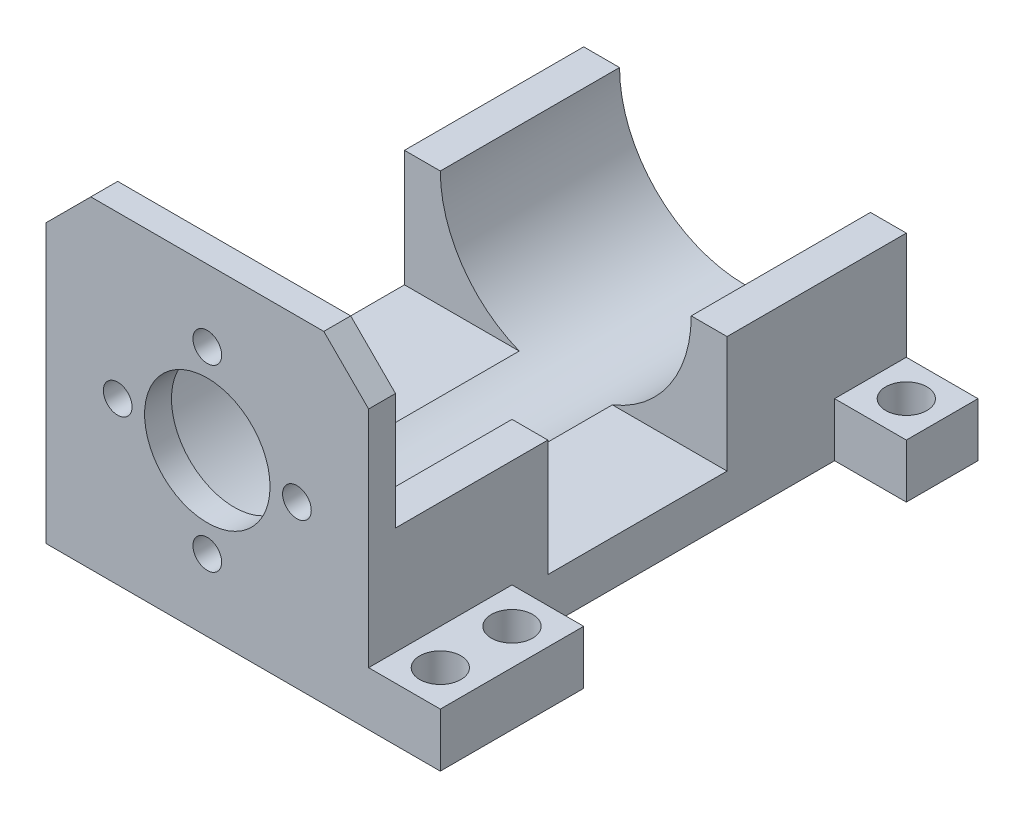
ISO-10303-21;
HEADER;
FILE_DESCRIPTION(('STEP AP214'),'2;1');
FILE_NAME('part.step','',(''),(''),'','','');
FILE_SCHEMA(('AUTOMOTIVE_DESIGN { 1 0 10303 214 1 1 1 1 }'));
ENDSEC;
DATA;
#1=APPLICATION_CONTEXT('core data for automotive mechanical design processes');
#2=APPLICATION_PROTOCOL_DEFINITION('international standard','automotive_design',2000,#1);
#3=PRODUCT_CONTEXT('',#1,'mechanical');
#4=PRODUCT('Part','Part','',(#3));
#5=PRODUCT_RELATED_PRODUCT_CATEGORY('part','',(#4));
#6=PRODUCT_DEFINITION_FORMATION('','',#4);
#7=PRODUCT_DEFINITION_CONTEXT('part definition',#1,'design');
#8=PRODUCT_DEFINITION('design','',#6,#7);
#9=PRODUCT_DEFINITION_SHAPE('','',#8);
#10=(LENGTH_UNIT() NAMED_UNIT(*) SI_UNIT(.MILLI.,.METRE.));
#11=(NAMED_UNIT(*) PLANE_ANGLE_UNIT() SI_UNIT($,.RADIAN.));
#12=(NAMED_UNIT(*) SI_UNIT($,.STERADIAN.) SOLID_ANGLE_UNIT());
#13=UNCERTAINTY_MEASURE_WITH_UNIT(LENGTH_MEASURE(1.E-05),#10,'distance_accuracy_value','');
#14=(GEOMETRIC_REPRESENTATION_CONTEXT(3) GLOBAL_UNCERTAINTY_ASSIGNED_CONTEXT((#13)) GLOBAL_UNIT_ASSIGNED_CONTEXT((#10,
#11,#12)) REPRESENTATION_CONTEXT('',''));
#15=CARTESIAN_POINT('',(0.,0.,0.));
#16=DIRECTION('',(0.,0.,1.));
#17=DIRECTION('',(1.,0.,0.));
#18=AXIS2_PLACEMENT_3D('',#15,#16,#17);
#19=CARTESIAN_POINT('',(18.,0.,-60.));
#20=DIRECTION('',(1.,0.,0.));
#21=DIRECTION('',(0.,0.,-1.));
#22=AXIS2_PLACEMENT_3D('',#19,#20,#21);
#23=PLANE('',#22);
#24=DIRECTION('',(0.,0.,1.));
#25=VECTOR('',#24,1.);
#26=CARTESIAN_POINT('',(18.,-12.,-16.));
#27=LINE('',#26,#25);
#28=CARTESIAN_POINT('',(18.,-12.,-16.));
#29=VERTEX_POINT('',#28);
#30=CARTESIAN_POINT('',(18.,-12.,0.));
#31=VERTEX_POINT('',#30);
#32=EDGE_CURVE('E282',#29,#31,#27,.T.);
#33=ORIENTED_EDGE('',*,*,#32,.F.);
#34=DIRECTION('',(0.,-1.,0.));
#35=VECTOR('',#34,1.);
#36=CARTESIAN_POINT('',(18.,-12.,-16.));
#37=LINE('',#36,#35);
#38=CARTESIAN_POINT('',(18.,-18.,-16.));
#39=VERTEX_POINT('',#38);
#40=EDGE_CURVE('E986',#29,#39,#37,.T.);
#41=ORIENTED_EDGE('',*,*,#40,.T.);
#42=DIRECTION('',(0.,0.,1.));
#43=VECTOR('',#42,1.);
#44=CARTESIAN_POINT('',(18.,-18.,-60.));
#45=LINE('',#44,#43);
#46=CARTESIAN_POINT('',(18.,-18.,-52.));
#47=VERTEX_POINT('',#46);
#48=EDGE_CURVE('E12',#47,#39,#45,.T.);
#49=ORIENTED_EDGE('',*,*,#48,.F.);
#50=DIRECTION('',(0.,-1.,0.));
#51=VECTOR('',#50,1.);
#52=CARTESIAN_POINT('',(18.,-12.,-52.));
#53=LINE('',#52,#51);
#54=CARTESIAN_POINT('',(18.,-12.,-52.));
#55=VERTEX_POINT('',#54);
#56=EDGE_CURVE('E345',#55,#47,#53,.T.);
#57=ORIENTED_EDGE('',*,*,#56,.F.);
#58=DIRECTION('',(0.,0.,1.));
#59=VECTOR('',#58,1.);
#60=CARTESIAN_POINT('',(18.,-12.,0.));
#61=LINE('',#60,#59);
#62=CARTESIAN_POINT('',(18.,-12.,-60.));
#63=VERTEX_POINT('',#62);
#64=EDGE_CURVE('E328',#63,#55,#61,.T.);
#65=ORIENTED_EDGE('',*,*,#64,.F.);
#66=DIRECTION('',(0.,1.,0.));
#67=VECTOR('',#66,1.);
#68=CARTESIAN_POINT('',(18.,0.,-60.));
#69=LINE('',#68,#67);
#70=CARTESIAN_POINT('',(18.,0.,-60.));
#71=VERTEX_POINT('',#70);
#72=EDGE_CURVE('E464',#63,#71,#69,.T.);
#73=ORIENTED_EDGE('',*,*,#72,.T.);
#74=DIRECTION('',(0.,0.,1.));
#75=VECTOR('',#74,1.);
#76=CARTESIAN_POINT('',(18.,0.,-60.));
#77=LINE('',#76,#75);
#78=CARTESIAN_POINT('',(18.,0.,-40.));
#79=VERTEX_POINT('',#78);
#80=EDGE_CURVE('E72',#71,#79,#77,.T.);
#81=ORIENTED_EDGE('',*,*,#80,.T.);
#82=DIRECTION('',(0.,1.,0.));
#83=VECTOR('',#82,1.);
#84=CARTESIAN_POINT('',(18.,0.,-40.));
#85=LINE('',#84,#83);
#86=CARTESIAN_POINT('',(18.,-13.,-40.));
#87=VERTEX_POINT('',#86);
#88=EDGE_CURVE('E369',#87,#79,#85,.T.);
#89=ORIENTED_EDGE('',*,*,#88,.F.);
#90=DIRECTION('',(0.,0.,-1.));
#91=VECTOR('',#90,1.);
#92=CARTESIAN_POINT('',(18.,-13.,-60.));
#93=LINE('',#92,#91);
#94=CARTESIAN_POINT('',(18.,-13.,-20.));
#95=VERTEX_POINT('',#94);
#96=EDGE_CURVE('E375',#95,#87,#93,.T.);
#97=ORIENTED_EDGE('',*,*,#96,.F.);
#98=DIRECTION('',(0.,-1.,0.));
#99=VECTOR('',#98,1.);
#100=CARTESIAN_POINT('',(18.,0.,-20.));
#101=LINE('',#100,#99);
#102=CARTESIAN_POINT('',(18.,0.,-20.));
#103=VERTEX_POINT('',#102);
#104=EDGE_CURVE('E384',#103,#95,#101,.T.);
#105=ORIENTED_EDGE('',*,*,#104,.F.);
#106=CARTESIAN_POINT('',(18.,0.,-3.));
#107=VERTEX_POINT('',#106);
#108=EDGE_CURVE('E479',#103,#107,#77,.T.);
#109=ORIENTED_EDGE('',*,*,#108,.T.);
#110=DIRECTION('',(0.,-1.,0.));
#111=VECTOR('',#110,1.);
#112=CARTESIAN_POINT('',(18.,0.,-3.));
#113=LINE('',#112,#111);
#114=CARTESIAN_POINT('',(18.,13.,-3.));
#115=VERTEX_POINT('',#114);
#116=EDGE_CURVE('E412',#115,#107,#113,.T.);
#117=ORIENTED_EDGE('',*,*,#116,.F.);
#118=DIRECTION('',(0.,0.,1.));
#119=VECTOR('',#118,1.);
#120=CARTESIAN_POINT('',(18.,13.,-3.));
#121=LINE('',#120,#119);
#122=CARTESIAN_POINT('',(18.,13.,0.));
#123=VERTEX_POINT('',#122);
#124=EDGE_CURVE('E430',#115,#123,#121,.T.);
#125=ORIENTED_EDGE('',*,*,#124,.T.);
#126=DIRECTION('',(0.,1.,0.));
#127=VECTOR('',#126,1.);
#128=CARTESIAN_POINT('',(18.,0.,0.));
#129=LINE('',#128,#127);
#130=EDGE_CURVE('E457',#31,#123,#129,.T.);
#131=ORIENTED_EDGE('',*,*,#130,.F.);
#132=EDGE_LOOP('',(#33,#41,#49,#57,#65,#73,#81,#89,#97,#105,#109,#117,#125,#131));
#133=FACE_BOUND('',#132,.T.);
#134=ADVANCED_FACE('F69',(#133),#23,.T.);
#135=CARTESIAN_POINT('',(0.,0.,-60.));
#136=DIRECTION('',(0.,-1.,0.));
#137=DIRECTION('',(0.,0.,-1.));
#138=AXIS2_PLACEMENT_3D('',#135,#136,#137);
#139=PLANE('',#138);
#140=DIRECTION('',(0.,0.,1.));
#141=VECTOR('',#140,1.);
#142=CARTESIAN_POINT('',(-14.,0.,-60.));
#143=LINE('',#142,#141);
#144=CARTESIAN_POINT('',(-14.,0.,-20.));
#145=VERTEX_POINT('',#144);
#146=CARTESIAN_POINT('',(-14.,0.,-3.));
#147=VERTEX_POINT('',#146);
#148=EDGE_CURVE('E492',#145,#147,#143,.T.);
#149=ORIENTED_EDGE('',*,*,#148,.F.);
#150=DIRECTION('',(-1.,0.,0.));
#151=VECTOR('',#150,1.);
#152=CARTESIAN_POINT('',(32.,0.,-20.));
#153=LINE('',#152,#151);
#154=CARTESIAN_POINT('',(-18.,0.,-20.));
#155=VERTEX_POINT('',#154);
#156=EDGE_CURVE('E357',#145,#155,#153,.T.);
#157=ORIENTED_EDGE('',*,*,#156,.T.);
#158=DIRECTION('',(0.,0.,1.));
#159=VECTOR('',#158,1.);
#160=CARTESIAN_POINT('',(-18.,0.,-60.));
#161=LINE('',#160,#159);
#162=CARTESIAN_POINT('',(-18.,0.,-3.));
#163=VERTEX_POINT('',#162);
#164=EDGE_CURVE('E489',#155,#163,#161,.T.);
#165=ORIENTED_EDGE('',*,*,#164,.T.);
#166=DIRECTION('',(1.,0.,0.));
#167=VECTOR('',#166,1.);
#168=CARTESIAN_POINT('',(0.,0.,-3.));
#169=LINE('',#168,#167);
#170=EDGE_CURVE('E427',#163,#147,#169,.T.);
#171=ORIENTED_EDGE('',*,*,#170,.T.);
#172=EDGE_LOOP('',(#149,#157,#165,#171));
#173=FACE_BOUND('',#172,.T.);
#174=ADVANCED_FACE('F520',(#173),#139,.F.);
#175=CARTESIAN_POINT('',(0.,0.,-60.));
#176=DIRECTION('',(0.,1.,0.));
#177=DIRECTION('',(0.,0.,1.));
#178=AXIS2_PLACEMENT_3D('',#175,#176,#177);
#179=PLANE('',#178);
#180=CARTESIAN_POINT('',(14.,0.,-20.));
#181=VERTEX_POINT('',#180);
#182=EDGE_CURVE('E360',#103,#181,#153,.T.);
#183=ORIENTED_EDGE('',*,*,#182,.T.);
#184=DIRECTION('',(0.,0.,1.));
#185=VECTOR('',#184,1.);
#186=CARTESIAN_POINT('',(14.,0.,-60.));
#187=LINE('',#186,#185);
#188=CARTESIAN_POINT('',(14.,0.,-3.));
#189=VERTEX_POINT('',#188);
#190=EDGE_CURVE('E495',#181,#189,#187,.T.);
#191=ORIENTED_EDGE('',*,*,#190,.T.);
#192=DIRECTION('',(-1.,0.,0.));
#193=VECTOR('',#192,1.);
#194=CARTESIAN_POINT('',(0.,0.,-3.));
#195=LINE('',#194,#193);
#196=EDGE_CURVE('E409',#107,#189,#195,.T.);
#197=ORIENTED_EDGE('',*,*,#196,.F.);
#198=ORIENTED_EDGE('',*,*,#108,.F.);
#199=EDGE_LOOP('',(#183,#191,#197,#198));
#200=FACE_BOUND('',#199,.T.);
#201=ADVANCED_FACE('F517',(#200),#179,.T.);
#202=CARTESIAN_POINT('',(-18.,0.,-60.));
#203=VERTEX_POINT('',#202);
#204=CARTESIAN_POINT('',(-18.,0.,-40.));
#205=VERTEX_POINT('',#204);
#206=EDGE_CURVE('E486',#203,#205,#161,.T.);
#207=ORIENTED_EDGE('',*,*,#206,.T.);
#208=DIRECTION('',(-1.,0.,0.));
#209=VECTOR('',#208,1.);
#210=CARTESIAN_POINT('',(32.,0.,-40.));
#211=LINE('',#210,#209);
#212=CARTESIAN_POINT('',(-14.,0.,-40.));
#213=VERTEX_POINT('',#212);
#214=EDGE_CURVE('E356',#213,#205,#211,.T.);
#215=ORIENTED_EDGE('',*,*,#214,.F.);
#216=CARTESIAN_POINT('',(-14.,0.,-60.));
#217=VERTEX_POINT('',#216);
#218=EDGE_CURVE('E490',#217,#213,#143,.T.);
#219=ORIENTED_EDGE('',*,*,#218,.F.);
#220=DIRECTION('',(1.,0.,0.));
#221=VECTOR('',#220,1.);
#222=CARTESIAN_POINT('',(0.,0.,-60.));
#223=LINE('',#222,#221);
#224=EDGE_CURVE('E472',#203,#217,#223,.T.);
#225=ORIENTED_EDGE('',*,*,#224,.F.);
#226=EDGE_LOOP('',(#207,#215,#219,#225));
#227=FACE_BOUND('',#226,.T.);
#228=ADVANCED_FACE('F519',(#227),#139,.F.);
#229=CARTESIAN_POINT('',(0.,0.,-60.));
#230=DIRECTION('',(0.,0.,1.));
#231=DIRECTION('',(1.,0.,0.));
#232=AXIS2_PLACEMENT_3D('',#229,#230,#231);
#233=CYLINDRICAL_SURFACE('',#232,14.);
#234=DIRECTION('',(0.,0.,1.));
#235=VECTOR('',#234,1.);
#236=CARTESIAN_POINT('',(-5.19615242270665,-13.,-60.));
#237=LINE('',#236,#235);
#238=CARTESIAN_POINT('',(-5.19615242270665,-13.,-40.));
#239=VERTEX_POINT('',#238);
#240=CARTESIAN_POINT('',(-5.19615242270664,-13.,-20.));
#241=VERTEX_POINT('',#240);
#242=EDGE_CURVE('E378',#239,#241,#237,.T.);
#243=ORIENTED_EDGE('',*,*,#242,.T.);
#244=CARTESIAN_POINT('',(0.,0.,-20.));
#245=DIRECTION('',(0.,0.,1.));
#246=DIRECTION('',(1.,0.,0.));
#247=AXIS2_PLACEMENT_3D('',#244,#245,#246);
#248=CIRCLE('',#247,14.);
#249=EDGE_CURVE('E386',#241,#145,#248,.F.);
#250=ORIENTED_EDGE('',*,*,#249,.T.);
#251=ORIENTED_EDGE('',*,*,#148,.T.);
#252=CARTESIAN_POINT('',(0.,0.,-3.));
#253=DIRECTION('',(0.,0.,1.));
#254=DIRECTION('',(1.,0.,0.));
#255=AXIS2_PLACEMENT_3D('',#252,#253,#254);
#256=CIRCLE('',#255,14.);
#257=EDGE_CURVE('E406',#147,#189,#256,.T.);
#258=ORIENTED_EDGE('',*,*,#257,.T.);
#259=ORIENTED_EDGE('',*,*,#190,.F.);
#260=CARTESIAN_POINT('',(5.19615242270665,-13.,-20.));
#261=VERTEX_POINT('',#260);
#262=EDGE_CURVE('E389',#181,#261,#248,.F.);
#263=ORIENTED_EDGE('',*,*,#262,.T.);
#264=DIRECTION('',(0.,0.,1.));
#265=VECTOR('',#264,1.);
#266=CARTESIAN_POINT('',(5.19615242270665,-13.,-60.));
#267=LINE('',#266,#265);
#268=CARTESIAN_POINT('',(5.19615242270665,-13.,-40.));
#269=VERTEX_POINT('',#268);
#270=EDGE_CURVE('E381',#261,#269,#267,.F.);
#271=ORIENTED_EDGE('',*,*,#270,.T.);
#272=CARTESIAN_POINT('',(0.,0.,-40.));
#273=DIRECTION('',(0.,0.,-1.));
#274=DIRECTION('',(-1.,0.,0.));
#275=AXIS2_PLACEMENT_3D('',#272,#273,#274);
#276=CIRCLE('',#275,14.);
#277=CARTESIAN_POINT('',(14.,0.,-40.));
#278=VERTEX_POINT('',#277);
#279=EDGE_CURVE('E371',#269,#278,#276,.F.);
#280=ORIENTED_EDGE('',*,*,#279,.T.);
#281=CARTESIAN_POINT('',(14.,0.,-60.));
#282=VERTEX_POINT('',#281);
#283=EDGE_CURVE('E493',#282,#278,#187,.T.);
#284=ORIENTED_EDGE('',*,*,#283,.F.);
#285=CARTESIAN_POINT('',(0.,0.,-60.));
#286=DIRECTION('',(0.,0.,1.));
#287=DIRECTION('',(1.,0.,0.));
#288=AXIS2_PLACEMENT_3D('',#285,#286,#287);
#289=CIRCLE('',#288,14.);
#290=EDGE_CURVE('E470',#217,#282,#289,.T.);
#291=ORIENTED_EDGE('',*,*,#290,.F.);
#292=ORIENTED_EDGE('',*,*,#218,.T.);
#293=EDGE_CURVE('E374',#213,#239,#276,.F.);
#294=ORIENTED_EDGE('',*,*,#293,.T.);
#295=EDGE_LOOP('',(#243,#250,#251,#258,#259,#263,#271,#280,#284,#291,#292,#294));
#296=FACE_BOUND('',#295,.T.);
#297=ADVANCED_FACE('F526',(#296),#233,.F.);
#298=EDGE_CURVE('E367',#79,#278,#211,.T.);
#299=ORIENTED_EDGE('',*,*,#298,.F.);
#300=ORIENTED_EDGE('',*,*,#80,.F.);
#301=DIRECTION('',(-1.,0.,0.));
#302=VECTOR('',#301,1.);
#303=CARTESIAN_POINT('',(0.,0.,-60.));
#304=LINE('',#303,#302);
#305=EDGE_CURVE('E466',#71,#282,#304,.T.);
#306=ORIENTED_EDGE('',*,*,#305,.T.);
#307=ORIENTED_EDGE('',*,*,#283,.T.);
#308=EDGE_LOOP('',(#299,#300,#306,#307));
#309=FACE_BOUND('',#308,.T.);
#310=ADVANCED_FACE('F521',(#309),#179,.T.);
#311=CARTESIAN_POINT('',(0.,-18.,-60.));
#312=DIRECTION('',(0.,-1.,0.));
#313=DIRECTION('',(0.,0.,-1.));
#314=AXIS2_PLACEMENT_3D('',#311,#312,#313);
#315=PLANE('',#314);
#316=DIRECTION('',(1.,0.,0.));
#317=VECTOR('',#316,1.);
#318=CARTESIAN_POINT('',(0.,-18.,0.));
#319=LINE('',#318,#317);
#320=CARTESIAN_POINT('',(-18.,-18.,0.));
#321=VERTEX_POINT('',#320);
#322=CARTESIAN_POINT('',(26.,-18.,0.));
#323=VERTEX_POINT('',#322);
#324=EDGE_CURVE('E467',#321,#323,#319,.T.);
#325=ORIENTED_EDGE('',*,*,#324,.F.);
#326=DIRECTION('',(0.,0.,1.));
#327=VECTOR('',#326,1.);
#328=CARTESIAN_POINT('',(-18.,-18.,-60.));
#329=LINE('',#328,#327);
#330=CARTESIAN_POINT('',(-18.,-18.,-52.));
#331=VERTEX_POINT('',#330);
#332=EDGE_CURVE('E77',#331,#321,#329,.T.);
#333=ORIENTED_EDGE('',*,*,#332,.F.);
#334=DIRECTION('',(1.,0.,0.));
#335=VECTOR('',#334,1.);
#336=CARTESIAN_POINT('',(0.,-18.,-52.));
#337=LINE('',#336,#335);
#338=CARTESIAN_POINT('',(-30.,-18.,-52.));
#339=VERTEX_POINT('',#338);
#340=EDGE_CURVE('E93',#339,#331,#337,.T.);
#341=ORIENTED_EDGE('',*,*,#340,.F.);
#342=DIRECTION('',(0.,0.,1.));
#343=VECTOR('',#342,1.);
#344=CARTESIAN_POINT('',(-30.,-18.,0.));
#345=LINE('',#344,#343);
#346=CARTESIAN_POINT('',(-30.,-18.,-60.));
#347=VERTEX_POINT('',#346);
#348=EDGE_CURVE('E301',#347,#339,#345,.T.);
#349=ORIENTED_EDGE('',*,*,#348,.F.);
#350=DIRECTION('',(1.,0.,0.));
#351=VECTOR('',#350,1.);
#352=CARTESIAN_POINT('',(0.,-18.,-60.));
#353=LINE('',#352,#351);
#354=CARTESIAN_POINT('',(26.,-18.,-60.));
#355=VERTEX_POINT('',#354);
#356=EDGE_CURVE('E477',#347,#355,#353,.T.);
#357=ORIENTED_EDGE('',*,*,#356,.T.);
#358=DIRECTION('',(0.,0.,1.));
#359=VECTOR('',#358,1.);
#360=CARTESIAN_POINT('',(26.,-18.,0.));
#361=LINE('',#360,#359);
#362=CARTESIAN_POINT('',(26.,-18.,-52.));
#363=VERTEX_POINT('',#362);
#364=EDGE_CURVE('E337',#355,#363,#361,.T.);
#365=ORIENTED_EDGE('',*,*,#364,.T.);
#366=DIRECTION('',(-1.,0.,0.));
#367=VECTOR('',#366,1.);
#368=CARTESIAN_POINT('',(0.,-18.,-52.));
#369=LINE('',#368,#367);
#370=EDGE_CURVE('E322',#363,#47,#369,.T.);
#371=ORIENTED_EDGE('',*,*,#370,.T.);
#372=ORIENTED_EDGE('',*,*,#48,.T.);
#373=DIRECTION('',(-1.,0.,0.));
#374=VECTOR('',#373,1.);
#375=CARTESIAN_POINT('',(26.,-18.,-16.));
#376=LINE('',#375,#374);
#377=CARTESIAN_POINT('',(26.,-18.,-16.));
#378=VERTEX_POINT('',#377);
#379=EDGE_CURVE('E262',#378,#39,#376,.T.);
#380=ORIENTED_EDGE('',*,*,#379,.F.);
#381=DIRECTION('',(0.,0.,-1.));
#382=VECTOR('',#381,1.);
#383=CARTESIAN_POINT('',(26.,-18.,0.));
#384=LINE('',#383,#382);
#385=EDGE_CURVE('E252',#323,#378,#384,.T.);
#386=ORIENTED_EDGE('',*,*,#385,.F.);
#387=EDGE_LOOP('',(#325,#333,#341,#349,#357,#365,#371,#372,#380,#386));
#388=FACE_BOUND('',#387,.T.);
#389=CARTESIAN_POINT('',(22.,-18.,-56.));
#390=DIRECTION('',(0.,-1.,0.));
#391=DIRECTION('',(0.,0.,-1.));
#392=AXIS2_PLACEMENT_3D('',#389,#390,#391);
#393=CIRCLE('',#392,2.3);
#394=CARTESIAN_POINT('',(22.,-18.,-58.3));
#395=VERTEX_POINT('',#394);
#396=EDGE_CURVE('E308',#395,#395,#393,.T.);
#397=ORIENTED_EDGE('',*,*,#396,.F.);
#398=EDGE_LOOP('',(#397));
#399=FACE_BOUND('',#398,.T.);
#400=CARTESIAN_POINT('',(-26.,-18.,-56.));
#401=DIRECTION('',(0.,-1.,0.));
#402=DIRECTION('',(0.,0.,-1.));
#403=AXIS2_PLACEMENT_3D('',#400,#401,#402);
#404=CIRCLE('',#403,2.3);
#405=CARTESIAN_POINT('',(-26.,-18.,-58.3));
#406=VERTEX_POINT('',#405);
#407=EDGE_CURVE('E305',#406,#406,#404,.T.);
#408=ORIENTED_EDGE('',*,*,#407,.F.);
#409=EDGE_LOOP('',(#408));
#410=FACE_BOUND('',#409,.T.);
#411=CARTESIAN_POINT('',(22.,-18.,-4.));
#412=DIRECTION('',(0.,-1.,0.));
#413=DIRECTION('',(0.,0.,-1.));
#414=AXIS2_PLACEMENT_3D('',#411,#412,#413);
#415=CIRCLE('',#414,2.3);
#416=CARTESIAN_POINT('',(22.,-18.,-6.3));
#417=VERTEX_POINT('',#416);
#418=EDGE_CURVE('E288',#417,#417,#415,.T.);
#419=ORIENTED_EDGE('',*,*,#418,.F.);
#420=EDGE_LOOP('',(#419));
#421=FACE_BOUND('',#420,.T.);
#422=CARTESIAN_POINT('',(22.,-18.,-12.));
#423=DIRECTION('',(0.,-1.,0.));
#424=DIRECTION('',(0.,0.,-1.));
#425=AXIS2_PLACEMENT_3D('',#422,#423,#424);
#426=CIRCLE('',#425,2.3);
#427=CARTESIAN_POINT('',(22.,-18.,-14.3));
#428=VERTEX_POINT('',#427);
#429=EDGE_CURVE('E277',#428,#428,#426,.T.);
#430=ORIENTED_EDGE('',*,*,#429,.F.);
#431=EDGE_LOOP('',(#430));
#432=FACE_BOUND('',#431,.T.);
#433=ADVANCED_FACE('F271',(#388,#399,#410,#421,#432),#315,.T.);
#434=CARTESIAN_POINT('',(-18.,0.,-60.));
#435=DIRECTION('',(-1.,0.,0.));
#436=DIRECTION('',(0.,-1.,0.));
#437=AXIS2_PLACEMENT_3D('',#434,#435,#436);
#438=PLANE('',#437);
#439=DIRECTION('',(0.,0.,-1.));
#440=VECTOR('',#439,1.);
#441=CARTESIAN_POINT('',(-18.,-12.,0.));
#442=LINE('',#441,#440);
#443=CARTESIAN_POINT('',(-18.,-12.,-52.));
#444=VERTEX_POINT('',#443);
#445=CARTESIAN_POINT('',(-18.,-12.,-60.));
#446=VERTEX_POINT('',#445);
#447=EDGE_CURVE('E296',#444,#446,#442,.T.);
#448=ORIENTED_EDGE('',*,*,#447,.F.);
#449=DIRECTION('',(0.,-1.,0.));
#450=VECTOR('',#449,1.);
#451=CARTESIAN_POINT('',(-18.,-12.,-52.));
#452=LINE('',#451,#450);
#453=EDGE_CURVE('E291',#444,#331,#452,.T.);
#454=ORIENTED_EDGE('',*,*,#453,.T.);
#455=ORIENTED_EDGE('',*,*,#332,.T.);
#456=DIRECTION('',(0.,-1.,0.));
#457=VECTOR('',#456,1.);
#458=CARTESIAN_POINT('',(-18.,0.,0.));
#459=LINE('',#458,#457);
#460=CARTESIAN_POINT('',(-18.,13.,0.));
#461=VERTEX_POINT('',#460);
#462=EDGE_CURVE('E481',#461,#321,#459,.T.);
#463=ORIENTED_EDGE('',*,*,#462,.F.);
#464=DIRECTION('',(0.,0.,1.));
#465=VECTOR('',#464,1.);
#466=CARTESIAN_POINT('',(-18.,13.,-3.));
#467=LINE('',#466,#465);
#468=CARTESIAN_POINT('',(-18.,13.,-3.));
#469=VERTEX_POINT('',#468);
#470=EDGE_CURVE('E454',#469,#461,#467,.T.);
#471=ORIENTED_EDGE('',*,*,#470,.F.);
#472=DIRECTION('',(0.,-1.,0.));
#473=VECTOR('',#472,1.);
#474=CARTESIAN_POINT('',(-18.,0.,-3.));
#475=LINE('',#474,#473);
#476=EDGE_CURVE('E424',#469,#163,#475,.T.);
#477=ORIENTED_EDGE('',*,*,#476,.T.);
#478=ORIENTED_EDGE('',*,*,#164,.F.);
#479=DIRECTION('',(0.,1.,0.));
#480=VECTOR('',#479,1.);
#481=CARTESIAN_POINT('',(-18.,-13.,-20.));
#482=LINE('',#481,#480);
#483=CARTESIAN_POINT('',(-18.,-13.,-20.));
#484=VERTEX_POINT('',#483);
#485=EDGE_CURVE('E354',#484,#155,#482,.T.);
#486=ORIENTED_EDGE('',*,*,#485,.F.);
#487=DIRECTION('',(0.,0.,1.));
#488=VECTOR('',#487,1.);
#489=CARTESIAN_POINT('',(-18.,-13.,-40.));
#490=LINE('',#489,#488);
#491=CARTESIAN_POINT('',(-18.,-13.,-40.));
#492=VERTEX_POINT('',#491);
#493=EDGE_CURVE('E351',#492,#484,#490,.T.);
#494=ORIENTED_EDGE('',*,*,#493,.F.);
#495=DIRECTION('',(0.,-1.,0.));
#496=VECTOR('',#495,1.);
#497=CARTESIAN_POINT('',(-18.,-13.,-40.));
#498=LINE('',#497,#496);
#499=EDGE_CURVE('E344',#205,#492,#498,.T.);
#500=ORIENTED_EDGE('',*,*,#499,.F.);
#501=ORIENTED_EDGE('',*,*,#206,.F.);
#502=DIRECTION('',(0.,-1.,0.));
#503=VECTOR('',#502,1.);
#504=CARTESIAN_POINT('',(-18.,0.,-60.));
#505=LINE('',#504,#503);
#506=EDGE_CURVE('E474',#203,#446,#505,.T.);
#507=ORIENTED_EDGE('',*,*,#506,.T.);
#508=EDGE_LOOP('',(#448,#454,#455,#463,#471,#477,#478,#486,#494,#500,#501,#507));
#509=FACE_BOUND('',#508,.T.);
#510=ADVANCED_FACE('F780',(#509),#438,.T.);
#511=CARTESIAN_POINT('',(0.,0.,-60.));
#512=DIRECTION('',(0.,0.,1.));
#513=DIRECTION('',(1.,0.,0.));
#514=AXIS2_PLACEMENT_3D('',#511,#512,#513);
#515=PLANE('',#514);
#516=ORIENTED_EDGE('',*,*,#72,.F.);
#517=DIRECTION('',(1.,0.,0.));
#518=VECTOR('',#517,1.);
#519=CARTESIAN_POINT('',(0.,-12.,-60.));
#520=LINE('',#519,#518);
#521=CARTESIAN_POINT('',(26.,-12.,-60.));
#522=VERTEX_POINT('',#521);
#523=EDGE_CURVE('E331',#63,#522,#520,.T.);
#524=ORIENTED_EDGE('',*,*,#523,.T.);
#525=DIRECTION('',(0.,-1.,0.));
#526=VECTOR('',#525,1.);
#527=CARTESIAN_POINT('',(26.,-12.,-60.));
#528=LINE('',#527,#526);
#529=EDGE_CURVE('E341',#522,#355,#528,.T.);
#530=ORIENTED_EDGE('',*,*,#529,.T.);
#531=ORIENTED_EDGE('',*,*,#356,.F.);
#532=DIRECTION('',(0.,-1.,0.));
#533=VECTOR('',#532,1.);
#534=CARTESIAN_POINT('',(-30.,-12.,-60.));
#535=LINE('',#534,#533);
#536=CARTESIAN_POINT('',(-30.,-12.,-60.));
#537=VERTEX_POINT('',#536);
#538=EDGE_CURVE('E297',#537,#347,#535,.T.);
#539=ORIENTED_EDGE('',*,*,#538,.F.);
#540=DIRECTION('',(-1.,0.,0.));
#541=VECTOR('',#540,1.);
#542=CARTESIAN_POINT('',(0.,-12.,-60.));
#543=LINE('',#542,#541);
#544=EDGE_CURVE('E310',#446,#537,#543,.T.);
#545=ORIENTED_EDGE('',*,*,#544,.F.);
#546=ORIENTED_EDGE('',*,*,#506,.F.);
#547=ORIENTED_EDGE('',*,*,#224,.T.);
#548=ORIENTED_EDGE('',*,*,#290,.T.);
#549=ORIENTED_EDGE('',*,*,#305,.F.);
#550=EDGE_LOOP('',(#516,#524,#530,#531,#539,#545,#546,#547,#548,#549));
#551=FACE_BOUND('',#550,.T.);
#552=ADVANCED_FACE('F768',(#551),#515,.F.);
#553=CARTESIAN_POINT('',(0.,0.,0.));
#554=DIRECTION('',(0.,0.,1.));
#555=DIRECTION('',(1.,0.,0.));
#556=AXIS2_PLACEMENT_3D('',#553,#554,#555);
#557=PLANE('',#556);
#558=ORIENTED_EDGE('',*,*,#324,.T.);
#559=DIRECTION('',(0.,-1.,0.));
#560=VECTOR('',#559,1.);
#561=CARTESIAN_POINT('',(26.,-12.,0.));
#562=LINE('',#561,#560);
#563=CARTESIAN_POINT('',(26.,-12.,0.));
#564=VERTEX_POINT('',#563);
#565=EDGE_CURVE('E258',#564,#323,#562,.T.);
#566=ORIENTED_EDGE('',*,*,#565,.F.);
#567=DIRECTION('',(1.,0.,0.));
#568=VECTOR('',#567,1.);
#569=CARTESIAN_POINT('',(18.,-12.,0.));
#570=LINE('',#569,#568);
#571=EDGE_CURVE('E85',#31,#564,#570,.T.);
#572=ORIENTED_EDGE('',*,*,#571,.F.);
#573=ORIENTED_EDGE('',*,*,#130,.T.);
#574=DIRECTION('',(0.707106781186548,-0.707106781186548,0.));
#575=VECTOR('',#574,1.);
#576=CARTESIAN_POINT('',(15.5,15.5,0.));
#577=LINE('',#576,#575);
#578=CARTESIAN_POINT('',(13.,18.,0.));
#579=VERTEX_POINT('',#578);
#580=EDGE_CURVE('E446',#579,#123,#577,.T.);
#581=ORIENTED_EDGE('',*,*,#580,.F.);
#582=DIRECTION('',(-1.,0.,0.));
#583=VECTOR('',#582,1.);
#584=CARTESIAN_POINT('',(0.,18.,0.));
#585=LINE('',#584,#583);
#586=CARTESIAN_POINT('',(-13.,18.,0.));
#587=VERTEX_POINT('',#586);
#588=EDGE_CURVE('E449',#579,#587,#585,.T.);
#589=ORIENTED_EDGE('',*,*,#588,.T.);
#590=DIRECTION('',(-0.707106781186548,-0.707106781186548,0.));
#591=VECTOR('',#590,1.);
#592=CARTESIAN_POINT('',(-15.5,15.5,0.));
#593=LINE('',#592,#591);
#594=EDGE_CURVE('E394',#587,#461,#593,.T.);
#595=ORIENTED_EDGE('',*,*,#594,.T.);
#596=ORIENTED_EDGE('',*,*,#462,.T.);
#597=EDGE_LOOP('',(#558,#566,#572,#573,#581,#589,#595,#596));
#598=FACE_BOUND('',#597,.T.);
#599=CARTESIAN_POINT('',(0.,0.,0.));
#600=DIRECTION('',(0.,0.,1.));
#601=DIRECTION('',(1.,0.,0.));
#602=AXIS2_PLACEMENT_3D('',#599,#600,#601);
#603=CIRCLE('',#602,7.);
#604=CARTESIAN_POINT('',(7.,0.,0.));
#605=VERTEX_POINT('',#604);
#606=EDGE_CURVE('E431',#605,#605,#603,.T.);
#607=ORIENTED_EDGE('',*,*,#606,.F.);
#608=EDGE_LOOP('',(#607));
#609=FACE_BOUND('',#608,.T.);
#610=CARTESIAN_POINT('',(0.,-10.,0.));
#611=DIRECTION('',(0.,0.,1.));
#612=DIRECTION('',(1.,0.,0.));
#613=AXIS2_PLACEMENT_3D('',#610,#611,#612);
#614=CIRCLE('',#613,1.6);
#615=CARTESIAN_POINT('',(1.6,-10.,0.));
#616=VERTEX_POINT('',#615);
#617=EDGE_CURVE('E434',#616,#616,#614,.T.);
#618=ORIENTED_EDGE('',*,*,#617,.F.);
#619=EDGE_LOOP('',(#618));
#620=FACE_BOUND('',#619,.T.);
#621=CARTESIAN_POINT('',(10.,0.,0.));
#622=DIRECTION('',(0.,0.,1.));
#623=DIRECTION('',(1.,0.,0.));
#624=AXIS2_PLACEMENT_3D('',#621,#622,#623);
#625=CIRCLE('',#624,1.6);
#626=CARTESIAN_POINT('',(11.6,0.,0.));
#627=VERTEX_POINT('',#626);
#628=EDGE_CURVE('E437',#627,#627,#625,.T.);
#629=ORIENTED_EDGE('',*,*,#628,.F.);
#630=EDGE_LOOP('',(#629));
#631=FACE_BOUND('',#630,.T.);
#632=CARTESIAN_POINT('',(0.,10.,0.));
#633=DIRECTION('',(0.,0.,1.));
#634=DIRECTION('',(1.,0.,0.));
#635=AXIS2_PLACEMENT_3D('',#632,#633,#634);
#636=CIRCLE('',#635,1.6);
#637=CARTESIAN_POINT('',(1.6,10.,0.));
#638=VERTEX_POINT('',#637);
#639=EDGE_CURVE('E440',#638,#638,#636,.T.);
#640=ORIENTED_EDGE('',*,*,#639,.F.);
#641=EDGE_LOOP('',(#640));
#642=FACE_BOUND('',#641,.T.);
#643=CARTESIAN_POINT('',(-10.,0.,0.));
#644=DIRECTION('',(0.,0.,1.));
#645=DIRECTION('',(1.,0.,0.));
#646=AXIS2_PLACEMENT_3D('',#643,#644,#645);
#647=CIRCLE('',#646,1.6);
#648=CARTESIAN_POINT('',(-8.4,0.,0.));
#649=VERTEX_POINT('',#648);
#650=EDGE_CURVE('E443',#649,#649,#647,.T.);
#651=ORIENTED_EDGE('',*,*,#650,.F.);
#652=EDGE_LOOP('',(#651));
#653=FACE_BOUND('',#652,.T.);
#654=ADVANCED_FACE('F761',(#598,#609,#620,#631,#642,#653),#557,.T.);
#655=CARTESIAN_POINT('',(-15.5,15.5,-3.));
#656=DIRECTION('',(-0.707106781186547,0.707106781186547,0.));
#657=DIRECTION('',(-0.707106781186548,-0.707106781186548,0.));
#658=AXIS2_PLACEMENT_3D('',#655,#656,#657);
#659=PLANE('',#658);
#660=ORIENTED_EDGE('',*,*,#594,.F.);
#661=DIRECTION('',(0.,0.,1.));
#662=VECTOR('',#661,1.);
#663=CARTESIAN_POINT('',(-13.,18.,-3.));
#664=LINE('',#663,#662);
#665=CARTESIAN_POINT('',(-13.,18.,-3.));
#666=VERTEX_POINT('',#665);
#667=EDGE_CURVE('E458',#666,#587,#664,.T.);
#668=ORIENTED_EDGE('',*,*,#667,.F.);
#669=DIRECTION('',(-0.707106781186548,-0.707106781186548,0.));
#670=VECTOR('',#669,1.);
#671=CARTESIAN_POINT('',(-15.5,15.5,-3.));
#672=LINE('',#671,#670);
#673=EDGE_CURVE('E421',#666,#469,#672,.T.);
#674=ORIENTED_EDGE('',*,*,#673,.T.);
#675=ORIENTED_EDGE('',*,*,#470,.T.);
#676=EDGE_LOOP('',(#660,#668,#674,#675));
#677=FACE_BOUND('',#676,.T.);
#678=ADVANCED_FACE('F767',(#677),#659,.T.);
#679=CARTESIAN_POINT('',(0.,18.,-3.));
#680=DIRECTION('',(0.,1.,0.));
#681=DIRECTION('',(0.,0.,1.));
#682=AXIS2_PLACEMENT_3D('',#679,#680,#681);
#683=PLANE('',#682);
#684=ORIENTED_EDGE('',*,*,#588,.F.);
#685=DIRECTION('',(0.,0.,1.));
#686=VECTOR('',#685,1.);
#687=CARTESIAN_POINT('',(13.,18.,-3.));
#688=LINE('',#687,#686);
#689=CARTESIAN_POINT('',(13.,18.,-3.));
#690=VERTEX_POINT('',#689);
#691=EDGE_CURVE('E460',#690,#579,#688,.T.);
#692=ORIENTED_EDGE('',*,*,#691,.F.);
#693=DIRECTION('',(-1.,0.,0.));
#694=VECTOR('',#693,1.);
#695=CARTESIAN_POINT('',(0.,18.,-3.));
#696=LINE('',#695,#694);
#697=EDGE_CURVE('E418',#690,#666,#696,.T.);
#698=ORIENTED_EDGE('',*,*,#697,.T.);
#699=ORIENTED_EDGE('',*,*,#667,.T.);
#700=EDGE_LOOP('',(#684,#692,#698,#699));
#701=FACE_BOUND('',#700,.T.);
#702=ADVANCED_FACE('F869',(#701),#683,.T.);
#703=CARTESIAN_POINT('',(15.5,15.5,-3.));
#704=DIRECTION('',(-0.707106781186547,-0.707106781186547,0.));
#705=DIRECTION('',(0.707106781186548,-0.707106781186548,0.));
#706=AXIS2_PLACEMENT_3D('',#703,#704,#705);
#707=PLANE('',#706);
#708=ORIENTED_EDGE('',*,*,#580,.T.);
#709=ORIENTED_EDGE('',*,*,#124,.F.);
#710=DIRECTION('',(0.707106781186548,-0.707106781186548,0.));
#711=VECTOR('',#710,1.);
#712=CARTESIAN_POINT('',(15.5,15.5,-3.));
#713=LINE('',#712,#711);
#714=EDGE_CURVE('E415',#690,#115,#713,.T.);
#715=ORIENTED_EDGE('',*,*,#714,.F.);
#716=ORIENTED_EDGE('',*,*,#691,.T.);
#717=EDGE_LOOP('',(#708,#709,#715,#716));
#718=FACE_BOUND('',#717,.T.);
#719=ADVANCED_FACE('F865',(#718),#707,.F.);
#720=CARTESIAN_POINT('',(-10.,0.,-3.));
#721=DIRECTION('',(0.,0.,1.));
#722=DIRECTION('',(1.,0.,0.));
#723=AXIS2_PLACEMENT_3D('',#720,#721,#722);
#724=CYLINDRICAL_SURFACE('',#723,1.6);
#725=CARTESIAN_POINT('',(-10.,0.,-3.));
#726=DIRECTION('',(0.,0.,1.));
#727=DIRECTION('',(1.,0.,0.));
#728=AXIS2_PLACEMENT_3D('',#725,#726,#727);
#729=CIRCLE('',#728,1.6);
#730=CARTESIAN_POINT('',(-8.4,0.,-3.));
#731=VERTEX_POINT('',#730);
#732=EDGE_CURVE('E403',#731,#731,#729,.T.);
#733=ORIENTED_EDGE('',*,*,#732,.F.);
#734=EDGE_LOOP('',(#733));
#735=FACE_BOUND('',#734,.T.);
#736=ORIENTED_EDGE('',*,*,#650,.T.);
#737=EDGE_LOOP('',(#736));
#738=FACE_BOUND('',#737,.T.);
#739=ADVANCED_FACE('F861',(#735,#738),#724,.F.);
#740=CARTESIAN_POINT('',(0.,10.,-3.));
#741=DIRECTION('',(0.,0.,1.));
#742=DIRECTION('',(1.,0.,0.));
#743=AXIS2_PLACEMENT_3D('',#740,#741,#742);
#744=CYLINDRICAL_SURFACE('',#743,1.6);
#745=CARTESIAN_POINT('',(0.,10.,-3.));
#746=DIRECTION('',(0.,0.,1.));
#747=DIRECTION('',(1.,0.,0.));
#748=AXIS2_PLACEMENT_3D('',#745,#746,#747);
#749=CIRCLE('',#748,1.6);
#750=CARTESIAN_POINT('',(1.6,10.,-3.));
#751=VERTEX_POINT('',#750);
#752=EDGE_CURVE('E400',#751,#751,#749,.T.);
#753=ORIENTED_EDGE('',*,*,#752,.F.);
#754=EDGE_LOOP('',(#753));
#755=FACE_BOUND('',#754,.T.);
#756=ORIENTED_EDGE('',*,*,#639,.T.);
#757=EDGE_LOOP('',(#756));
#758=FACE_BOUND('',#757,.T.);
#759=ADVANCED_FACE('F857',(#755,#758),#744,.F.);
#760=CARTESIAN_POINT('',(10.,0.,-3.));
#761=DIRECTION('',(0.,0.,1.));
#762=DIRECTION('',(1.,0.,0.));
#763=AXIS2_PLACEMENT_3D('',#760,#761,#762);
#764=CYLINDRICAL_SURFACE('',#763,1.6);
#765=CARTESIAN_POINT('',(10.,0.,-3.));
#766=DIRECTION('',(0.,0.,1.));
#767=DIRECTION('',(1.,0.,0.));
#768=AXIS2_PLACEMENT_3D('',#765,#766,#767);
#769=CIRCLE('',#768,1.6);
#770=CARTESIAN_POINT('',(11.6,0.,-3.));
#771=VERTEX_POINT('',#770);
#772=EDGE_CURVE('E397',#771,#771,#769,.T.);
#773=ORIENTED_EDGE('',*,*,#772,.F.);
#774=EDGE_LOOP('',(#773));
#775=FACE_BOUND('',#774,.T.);
#776=ORIENTED_EDGE('',*,*,#628,.T.);
#777=EDGE_LOOP('',(#776));
#778=FACE_BOUND('',#777,.T.);
#779=ADVANCED_FACE('F853',(#775,#778),#764,.F.);
#780=CARTESIAN_POINT('',(0.,-10.,-3.));
#781=DIRECTION('',(0.,0.,1.));
#782=DIRECTION('',(1.,0.,0.));
#783=AXIS2_PLACEMENT_3D('',#780,#781,#782);
#784=CYLINDRICAL_SURFACE('',#783,1.6);
#785=CARTESIAN_POINT('',(0.,-10.,-3.));
#786=DIRECTION('',(0.,0.,1.));
#787=DIRECTION('',(1.,0.,0.));
#788=AXIS2_PLACEMENT_3D('',#785,#786,#787);
#789=CIRCLE('',#788,1.6);
#790=CARTESIAN_POINT('',(1.6,-10.,-3.));
#791=VERTEX_POINT('',#790);
#792=EDGE_CURVE('E393',#791,#791,#789,.T.);
#793=ORIENTED_EDGE('',*,*,#792,.F.);
#794=EDGE_LOOP('',(#793));
#795=FACE_BOUND('',#794,.T.);
#796=ORIENTED_EDGE('',*,*,#617,.T.);
#797=EDGE_LOOP('',(#796));
#798=FACE_BOUND('',#797,.T.);
#799=ADVANCED_FACE('F849',(#795,#798),#784,.F.);
#800=CARTESIAN_POINT('',(0.,0.,-3.));
#801=DIRECTION('',(0.,0.,1.));
#802=DIRECTION('',(1.,0.,0.));
#803=AXIS2_PLACEMENT_3D('',#800,#801,#802);
#804=CYLINDRICAL_SURFACE('',#803,7.);
#805=CARTESIAN_POINT('',(0.,0.,-3.));
#806=DIRECTION('',(0.,0.,1.));
#807=DIRECTION('',(1.,0.,0.));
#808=AXIS2_PLACEMENT_3D('',#805,#806,#807);
#809=CIRCLE('',#808,7.);
#810=CARTESIAN_POINT('',(7.,0.,-3.));
#811=VERTEX_POINT('',#810);
#812=EDGE_CURVE('E390',#811,#811,#809,.T.);
#813=ORIENTED_EDGE('',*,*,#812,.F.);
#814=EDGE_LOOP('',(#813));
#815=FACE_BOUND('',#814,.T.);
#816=ORIENTED_EDGE('',*,*,#606,.T.);
#817=EDGE_LOOP('',(#816));
#818=FACE_BOUND('',#817,.T.);
#819=ADVANCED_FACE('F846',(#815,#818),#804,.F.);
#820=CARTESIAN_POINT('',(0.,0.,-3.));
#821=DIRECTION('',(0.,0.,1.));
#822=DIRECTION('',(1.,0.,0.));
#823=AXIS2_PLACEMENT_3D('',#820,#821,#822);
#824=PLANE('',#823);
#825=ORIENTED_EDGE('',*,*,#812,.T.);
#826=EDGE_LOOP('',(#825));
#827=FACE_BOUND('',#826,.T.);
#828=ORIENTED_EDGE('',*,*,#792,.T.);
#829=EDGE_LOOP('',(#828));
#830=FACE_BOUND('',#829,.T.);
#831=ORIENTED_EDGE('',*,*,#772,.T.);
#832=EDGE_LOOP('',(#831));
#833=FACE_BOUND('',#832,.T.);
#834=ORIENTED_EDGE('',*,*,#752,.T.);
#835=EDGE_LOOP('',(#834));
#836=FACE_BOUND('',#835,.T.);
#837=ORIENTED_EDGE('',*,*,#732,.T.);
#838=EDGE_LOOP('',(#837));
#839=FACE_BOUND('',#838,.T.);
#840=ORIENTED_EDGE('',*,*,#257,.F.);
#841=ORIENTED_EDGE('',*,*,#170,.F.);
#842=ORIENTED_EDGE('',*,*,#476,.F.);
#843=ORIENTED_EDGE('',*,*,#673,.F.);
#844=ORIENTED_EDGE('',*,*,#697,.F.);
#845=ORIENTED_EDGE('',*,*,#714,.T.);
#846=ORIENTED_EDGE('',*,*,#116,.T.);
#847=ORIENTED_EDGE('',*,*,#196,.T.);
#848=EDGE_LOOP('',(#840,#841,#842,#843,#844,#845,#846,#847));
#849=FACE_BOUND('',#848,.T.);
#850=ADVANCED_FACE('F513',(#827,#830,#833,#836,#839,#849),#824,.F.);
#851=CARTESIAN_POINT('',(32.,-13.,-40.));
#852=DIRECTION('',(0.,0.,-1.));
#853=DIRECTION('',(-1.,0.,0.));
#854=AXIS2_PLACEMENT_3D('',#851,#852,#853);
#855=PLANE('',#854);
#856=ORIENTED_EDGE('',*,*,#214,.T.);
#857=ORIENTED_EDGE('',*,*,#499,.T.);
#858=DIRECTION('',(-1.,0.,0.));
#859=VECTOR('',#858,1.);
#860=CARTESIAN_POINT('',(32.,-13.,-40.));
#861=LINE('',#860,#859);
#862=EDGE_CURVE('E365',#239,#492,#861,.T.);
#863=ORIENTED_EDGE('',*,*,#862,.F.);
#864=ORIENTED_EDGE('',*,*,#293,.F.);
#865=EDGE_LOOP('',(#856,#857,#863,#864));
#866=FACE_BOUND('',#865,.T.);
#867=ADVANCED_FACE('F579',(#866),#855,.F.);
#868=CARTESIAN_POINT('',(32.,-13.,-40.));
#869=DIRECTION('',(0.,-1.,0.));
#870=DIRECTION('',(1.,0.,0.));
#871=AXIS2_PLACEMENT_3D('',#868,#869,#870);
#872=PLANE('',#871);
#873=ORIENTED_EDGE('',*,*,#862,.T.);
#874=ORIENTED_EDGE('',*,*,#493,.T.);
#875=DIRECTION('',(-1.,0.,0.));
#876=VECTOR('',#875,1.);
#877=CARTESIAN_POINT('',(32.,-13.,-20.));
#878=LINE('',#877,#876);
#879=EDGE_CURVE('E362',#241,#484,#878,.T.);
#880=ORIENTED_EDGE('',*,*,#879,.F.);
#881=ORIENTED_EDGE('',*,*,#242,.F.);
#882=EDGE_LOOP('',(#873,#874,#880,#881));
#883=FACE_BOUND('',#882,.T.);
#884=ADVANCED_FACE('F583',(#883),#872,.F.);
#885=CARTESIAN_POINT('',(32.,-13.,-20.));
#886=DIRECTION('',(0.,0.,1.));
#887=DIRECTION('',(1.,0.,0.));
#888=AXIS2_PLACEMENT_3D('',#885,#886,#887);
#889=PLANE('',#888);
#890=ORIENTED_EDGE('',*,*,#879,.T.);
#891=ORIENTED_EDGE('',*,*,#485,.T.);
#892=ORIENTED_EDGE('',*,*,#156,.F.);
#893=ORIENTED_EDGE('',*,*,#249,.F.);
#894=EDGE_LOOP('',(#890,#891,#892,#893));
#895=FACE_BOUND('',#894,.T.);
#896=ADVANCED_FACE('F594',(#895),#889,.F.);
#897=ORIENTED_EDGE('',*,*,#182,.F.);
#898=ORIENTED_EDGE('',*,*,#104,.T.);
#899=EDGE_CURVE('E361',#95,#261,#878,.T.);
#900=ORIENTED_EDGE('',*,*,#899,.T.);
#901=ORIENTED_EDGE('',*,*,#262,.F.);
#902=EDGE_LOOP('',(#897,#898,#900,#901));
#903=FACE_BOUND('',#902,.T.);
#904=ADVANCED_FACE('F605',(#903),#889,.F.);
#905=ORIENTED_EDGE('',*,*,#899,.F.);
#906=ORIENTED_EDGE('',*,*,#96,.T.);
#907=EDGE_CURVE('E364',#87,#269,#861,.T.);
#908=ORIENTED_EDGE('',*,*,#907,.T.);
#909=ORIENTED_EDGE('',*,*,#270,.F.);
#910=EDGE_LOOP('',(#905,#906,#908,#909));
#911=FACE_BOUND('',#910,.T.);
#912=ADVANCED_FACE('F597',(#911),#872,.F.);
#913=ORIENTED_EDGE('',*,*,#907,.F.);
#914=ORIENTED_EDGE('',*,*,#88,.T.);
#915=ORIENTED_EDGE('',*,*,#298,.T.);
#916=ORIENTED_EDGE('',*,*,#279,.F.);
#917=EDGE_LOOP('',(#913,#914,#915,#916));
#918=FACE_BOUND('',#917,.T.);
#919=ADVANCED_FACE('F586',(#918),#855,.F.);
#920=CARTESIAN_POINT('',(26.,-12.,0.));
#921=DIRECTION('',(1.,0.,0.));
#922=DIRECTION('',(0.,0.,-1.));
#923=AXIS2_PLACEMENT_3D('',#920,#921,#922);
#924=PLANE('',#923);
#925=ORIENTED_EDGE('',*,*,#364,.F.);
#926=ORIENTED_EDGE('',*,*,#529,.F.);
#927=DIRECTION('',(0.,0.,1.));
#928=VECTOR('',#927,1.);
#929=CARTESIAN_POINT('',(26.,-12.,0.));
#930=LINE('',#929,#928);
#931=CARTESIAN_POINT('',(26.,-12.,-52.));
#932=VERTEX_POINT('',#931);
#933=EDGE_CURVE('E321',#522,#932,#930,.T.);
#934=ORIENTED_EDGE('',*,*,#933,.T.);
#935=DIRECTION('',(0.,-1.,0.));
#936=VECTOR('',#935,1.);
#937=CARTESIAN_POINT('',(26.,-12.,-52.));
#938=LINE('',#937,#936);
#939=EDGE_CURVE('E334',#932,#363,#938,.T.);
#940=ORIENTED_EDGE('',*,*,#939,.T.);
#941=EDGE_LOOP('',(#925,#926,#934,#940));
#942=FACE_BOUND('',#941,.T.);
#943=ADVANCED_FACE('F629',(#942),#924,.T.);
#944=CARTESIAN_POINT('',(22.,-12.,-56.));
#945=DIRECTION('',(0.,-1.,0.));
#946=DIRECTION('',(0.,0.,-1.));
#947=AXIS2_PLACEMENT_3D('',#944,#945,#946);
#948=CYLINDRICAL_SURFACE('',#947,2.3);
#949=CARTESIAN_POINT('',(22.,-12.,-56.));
#950=DIRECTION('',(0.,-1.,0.));
#951=DIRECTION('',(0.,0.,-1.));
#952=AXIS2_PLACEMENT_3D('',#949,#950,#951);
#953=CIRCLE('',#952,2.3);
#954=CARTESIAN_POINT('',(22.,-12.,-58.3));
#955=VERTEX_POINT('',#954);
#956=EDGE_CURVE('E318',#955,#955,#953,.T.);
#957=ORIENTED_EDGE('',*,*,#956,.F.);
#958=EDGE_LOOP('',(#957));
#959=FACE_BOUND('',#958,.T.);
#960=ORIENTED_EDGE('',*,*,#396,.T.);
#961=EDGE_LOOP('',(#960));
#962=FACE_BOUND('',#961,.T.);
#963=ADVANCED_FACE('F639',(#959,#962),#948,.F.);
#964=CARTESIAN_POINT('',(0.,-12.,-52.));
#965=DIRECTION('',(0.,0.,1.));
#966=DIRECTION('',(1.,0.,0.));
#967=AXIS2_PLACEMENT_3D('',#964,#965,#966);
#968=PLANE('',#967);
#969=ORIENTED_EDGE('',*,*,#370,.F.);
#970=ORIENTED_EDGE('',*,*,#939,.F.);
#971=DIRECTION('',(-1.,0.,0.));
#972=VECTOR('',#971,1.);
#973=CARTESIAN_POINT('',(0.,-12.,-52.));
#974=LINE('',#973,#972);
#975=EDGE_CURVE('E325',#932,#55,#974,.T.);
#976=ORIENTED_EDGE('',*,*,#975,.T.);
#977=ORIENTED_EDGE('',*,*,#56,.T.);
#978=EDGE_LOOP('',(#969,#970,#976,#977));
#979=FACE_BOUND('',#978,.T.);
#980=ADVANCED_FACE('F648',(#979),#968,.T.);
#981=CARTESIAN_POINT('',(0.,-12.,0.));
#982=DIRECTION('',(0.,-1.,0.));
#983=DIRECTION('',(0.,0.,-1.));
#984=AXIS2_PLACEMENT_3D('',#981,#982,#983);
#985=PLANE('',#984);
#986=ORIENTED_EDGE('',*,*,#956,.T.);
#987=EDGE_LOOP('',(#986));
#988=FACE_BOUND('',#987,.T.);
#989=ORIENTED_EDGE('',*,*,#933,.F.);
#990=ORIENTED_EDGE('',*,*,#523,.F.);
#991=ORIENTED_EDGE('',*,*,#64,.T.);
#992=ORIENTED_EDGE('',*,*,#975,.F.);
#993=EDGE_LOOP('',(#989,#990,#991,#992));
#994=FACE_BOUND('',#993,.T.);
#995=ADVANCED_FACE('F656',(#988,#994),#985,.F.);
#996=CARTESIAN_POINT('',(0.,-12.,-52.));
#997=DIRECTION('',(0.,0.,-1.));
#998=DIRECTION('',(-1.,0.,0.));
#999=AXIS2_PLACEMENT_3D('',#996,#997,#998);
#1000=PLANE('',#999);
#1001=ORIENTED_EDGE('',*,*,#340,.T.);
#1002=ORIENTED_EDGE('',*,*,#453,.F.);
#1003=DIRECTION('',(1.,0.,0.));
#1004=VECTOR('',#1003,1.);
#1005=CARTESIAN_POINT('',(0.,-12.,-52.));
#1006=LINE('',#1005,#1004);
#1007=CARTESIAN_POINT('',(-30.,-12.,-52.));
#1008=VERTEX_POINT('',#1007);
#1009=EDGE_CURVE('E314',#1008,#444,#1006,.T.);
#1010=ORIENTED_EDGE('',*,*,#1009,.F.);
#1011=DIRECTION('',(0.,-1.,0.));
#1012=VECTOR('',#1011,1.);
#1013=CARTESIAN_POINT('',(-30.,-12.,-52.));
#1014=LINE('',#1013,#1012);
#1015=EDGE_CURVE('E294',#1008,#339,#1014,.T.);
#1016=ORIENTED_EDGE('',*,*,#1015,.T.);
#1017=EDGE_LOOP('',(#1001,#1002,#1010,#1016));
#1018=FACE_BOUND('',#1017,.T.);
#1019=ADVANCED_FACE('F664',(#1018),#1000,.F.);
#1020=CARTESIAN_POINT('',(-26.,-12.,-56.));
#1021=DIRECTION('',(0.,-1.,0.));
#1022=DIRECTION('',(0.,0.,-1.));
#1023=AXIS2_PLACEMENT_3D('',#1020,#1021,#1022);
#1024=CYLINDRICAL_SURFACE('',#1023,2.3);
#1025=CARTESIAN_POINT('',(-26.,-12.,-56.));
#1026=DIRECTION('',(0.,-1.,0.));
#1027=DIRECTION('',(0.,0.,-1.));
#1028=AXIS2_PLACEMENT_3D('',#1025,#1026,#1027);
#1029=CIRCLE('',#1028,2.3);
#1030=CARTESIAN_POINT('',(-26.,-12.,-58.3));
#1031=VERTEX_POINT('',#1030);
#1032=EDGE_CURVE('E303',#1031,#1031,#1029,.T.);
#1033=ORIENTED_EDGE('',*,*,#1032,.F.);
#1034=EDGE_LOOP('',(#1033));
#1035=FACE_BOUND('',#1034,.T.);
#1036=ORIENTED_EDGE('',*,*,#407,.T.);
#1037=EDGE_LOOP('',(#1036));
#1038=FACE_BOUND('',#1037,.T.);
#1039=ADVANCED_FACE('F672',(#1035,#1038),#1024,.F.);
#1040=CARTESIAN_POINT('',(-30.,-12.,0.));
#1041=DIRECTION('',(1.,0.,0.));
#1042=DIRECTION('',(0.,0.,-1.));
#1043=AXIS2_PLACEMENT_3D('',#1040,#1041,#1042);
#1044=PLANE('',#1043);
#1045=ORIENTED_EDGE('',*,*,#348,.T.);
#1046=ORIENTED_EDGE('',*,*,#1015,.F.);
#1047=DIRECTION('',(0.,0.,1.));
#1048=VECTOR('',#1047,1.);
#1049=CARTESIAN_POINT('',(-30.,-12.,0.));
#1050=LINE('',#1049,#1048);
#1051=EDGE_CURVE('E312',#537,#1008,#1050,.T.);
#1052=ORIENTED_EDGE('',*,*,#1051,.F.);
#1053=ORIENTED_EDGE('',*,*,#538,.T.);
#1054=EDGE_LOOP('',(#1045,#1046,#1052,#1053));
#1055=FACE_BOUND('',#1054,.T.);
#1056=ADVANCED_FACE('F679',(#1055),#1044,.F.);
#1057=CARTESIAN_POINT('',(0.,-12.,0.));
#1058=DIRECTION('',(0.,-1.,0.));
#1059=DIRECTION('',(0.,0.,-1.));
#1060=AXIS2_PLACEMENT_3D('',#1057,#1058,#1059);
#1061=PLANE('',#1060);
#1062=ORIENTED_EDGE('',*,*,#1032,.T.);
#1063=EDGE_LOOP('',(#1062));
#1064=FACE_BOUND('',#1063,.T.);
#1065=ORIENTED_EDGE('',*,*,#1009,.T.);
#1066=ORIENTED_EDGE('',*,*,#447,.T.);
#1067=ORIENTED_EDGE('',*,*,#544,.T.);
#1068=ORIENTED_EDGE('',*,*,#1051,.T.);
#1069=EDGE_LOOP('',(#1065,#1066,#1067,#1068));
#1070=FACE_BOUND('',#1069,.T.);
#1071=ADVANCED_FACE('F687',(#1064,#1070),#1061,.F.);
#1072=CARTESIAN_POINT('',(26.,-12.,-16.));
#1073=DIRECTION('',(0.,0.,1.));
#1074=DIRECTION('',(1.,0.,0.));
#1075=AXIS2_PLACEMENT_3D('',#1072,#1073,#1074);
#1076=PLANE('',#1075);
#1077=ORIENTED_EDGE('',*,*,#379,.T.);
#1078=ORIENTED_EDGE('',*,*,#40,.F.);
#1079=DIRECTION('',(-1.,0.,0.));
#1080=VECTOR('',#1079,1.);
#1081=CARTESIAN_POINT('',(26.,-12.,-16.));
#1082=LINE('',#1081,#1080);
#1083=CARTESIAN_POINT('',(26.,-12.,-16.));
#1084=VERTEX_POINT('',#1083);
#1085=EDGE_CURVE('E263',#1084,#29,#1082,.T.);
#1086=ORIENTED_EDGE('',*,*,#1085,.F.);
#1087=DIRECTION('',(0.,-1.,0.));
#1088=VECTOR('',#1087,1.);
#1089=CARTESIAN_POINT('',(26.,-12.,-16.));
#1090=LINE('',#1089,#1088);
#1091=EDGE_CURVE('E256',#1084,#378,#1090,.T.);
#1092=ORIENTED_EDGE('',*,*,#1091,.T.);
#1093=EDGE_LOOP('',(#1077,#1078,#1086,#1092));
#1094=FACE_BOUND('',#1093,.T.);
#1095=ADVANCED_FACE('F266',(#1094),#1076,.F.);
#1096=CARTESIAN_POINT('',(26.,-12.,0.));
#1097=DIRECTION('',(-1.,0.,0.));
#1098=DIRECTION('',(0.,0.,1.));
#1099=AXIS2_PLACEMENT_3D('',#1096,#1097,#1098);
#1100=PLANE('',#1099);
#1101=ORIENTED_EDGE('',*,*,#385,.T.);
#1102=ORIENTED_EDGE('',*,*,#1091,.F.);
#1103=DIRECTION('',(0.,0.,-1.));
#1104=VECTOR('',#1103,1.);
#1105=CARTESIAN_POINT('',(26.,-12.,0.));
#1106=LINE('',#1105,#1104);
#1107=EDGE_CURVE('E269',#564,#1084,#1106,.T.);
#1108=ORIENTED_EDGE('',*,*,#1107,.F.);
#1109=ORIENTED_EDGE('',*,*,#565,.T.);
#1110=EDGE_LOOP('',(#1101,#1102,#1108,#1109));
#1111=FACE_BOUND('',#1110,.T.);
#1112=ADVANCED_FACE('F254',(#1111),#1100,.F.);
#1113=CARTESIAN_POINT('',(0.,-12.,0.));
#1114=DIRECTION('',(0.,1.,0.));
#1115=DIRECTION('',(0.,0.,1.));
#1116=AXIS2_PLACEMENT_3D('',#1113,#1114,#1115);
#1117=PLANE('',#1116);
#1118=CARTESIAN_POINT('',(22.,-12.,-4.));
#1119=DIRECTION('',(0.,-1.,0.));
#1120=DIRECTION('',(0.,0.,-1.));
#1121=AXIS2_PLACEMENT_3D('',#1118,#1119,#1120);
#1122=CIRCLE('',#1121,2.3);
#1123=CARTESIAN_POINT('',(22.,-12.,-6.3));
#1124=VERTEX_POINT('',#1123);
#1125=EDGE_CURVE('E286',#1124,#1124,#1122,.T.);
#1126=ORIENTED_EDGE('',*,*,#1125,.T.);
#1127=EDGE_LOOP('',(#1126));
#1128=FACE_BOUND('',#1127,.T.);
#1129=CARTESIAN_POINT('',(22.,-12.,-12.));
#1130=DIRECTION('',(0.,-1.,0.));
#1131=DIRECTION('',(0.,0.,-1.));
#1132=AXIS2_PLACEMENT_3D('',#1129,#1130,#1131);
#1133=CIRCLE('',#1132,2.3);
#1134=CARTESIAN_POINT('',(22.,-12.,-14.3));
#1135=VERTEX_POINT('',#1134);
#1136=EDGE_CURVE('E274',#1135,#1135,#1133,.T.);
#1137=ORIENTED_EDGE('',*,*,#1136,.T.);
#1138=EDGE_LOOP('',(#1137));
#1139=FACE_BOUND('',#1138,.T.);
#1140=ORIENTED_EDGE('',*,*,#1085,.T.);
#1141=ORIENTED_EDGE('',*,*,#32,.T.);
#1142=ORIENTED_EDGE('',*,*,#571,.T.);
#1143=ORIENTED_EDGE('',*,*,#1107,.T.);
#1144=EDGE_LOOP('',(#1140,#1141,#1142,#1143));
#1145=FACE_BOUND('',#1144,.T.);
#1146=ADVANCED_FACE('F708',(#1128,#1139,#1145),#1117,.T.);
#1147=CARTESIAN_POINT('',(22.,-12.,-12.));
#1148=DIRECTION('',(0.,-1.,0.));
#1149=DIRECTION('',(0.,0.,-1.));
#1150=AXIS2_PLACEMENT_3D('',#1147,#1148,#1149);
#1151=CYLINDRICAL_SURFACE('',#1150,2.3);
#1152=ORIENTED_EDGE('',*,*,#1136,.F.);
#1153=EDGE_LOOP('',(#1152));
#1154=FACE_BOUND('',#1153,.T.);
#1155=ORIENTED_EDGE('',*,*,#429,.T.);
#1156=EDGE_LOOP('',(#1155));
#1157=FACE_BOUND('',#1156,.T.);
#1158=ADVANCED_FACE('F715',(#1154,#1157),#1151,.F.);
#1159=CARTESIAN_POINT('',(22.,-12.,-4.));
#1160=DIRECTION('',(0.,-1.,0.));
#1161=DIRECTION('',(0.,0.,-1.));
#1162=AXIS2_PLACEMENT_3D('',#1159,#1160,#1161);
#1163=CYLINDRICAL_SURFACE('',#1162,2.3);
#1164=ORIENTED_EDGE('',*,*,#1125,.F.);
#1165=EDGE_LOOP('',(#1164));
#1166=FACE_BOUND('',#1165,.T.);
#1167=ORIENTED_EDGE('',*,*,#418,.T.);
#1168=EDGE_LOOP('',(#1167));
#1169=FACE_BOUND('',#1168,.T.);
#1170=ADVANCED_FACE('F723',(#1166,#1169),#1163,.F.);
#1171=CLOSED_SHELL('',(#134,#174,#201,#228,#297,#310,#433,#510,#552,#654,#678,#702,#719,#739,
#759,#779,#799,#819,#850,#867,#884,#896,#904,#912,#919,#943,#963,#980,#995,#1019,#1039,#1056,
#1071,#1095,#1112,#1146,#1158,#1170));
#1172=MANIFOLD_SOLID_BREP('B2',#1171);
#1173=ADVANCED_BREP_SHAPE_REPRESENTATION('',(#18,#1172),#14);
#1174=SHAPE_DEFINITION_REPRESENTATION(#9,#1173);
ENDSEC;
END-ISO-10303-21;
